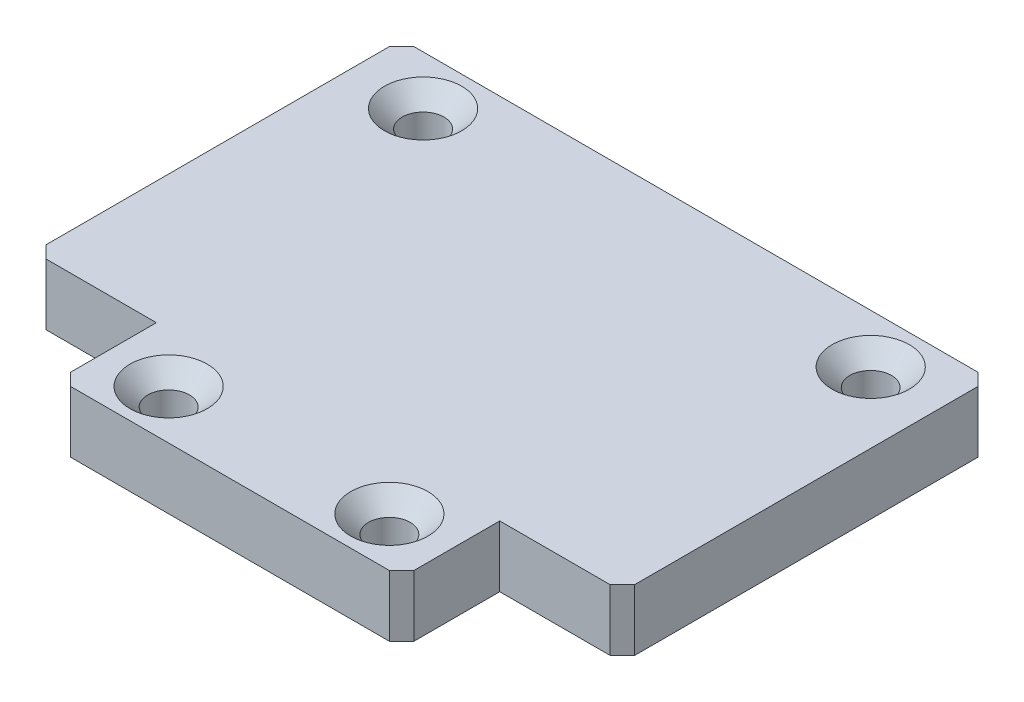
ISO-10303-21;
HEADER;
FILE_DESCRIPTION(('STEP AP214'),'2;1');
FILE_NAME('part.step','',(''),(''),'','','');
FILE_SCHEMA(('AUTOMOTIVE_DESIGN { 1 0 10303 214 1 1 1 1 }'));
ENDSEC;
DATA;
#1=APPLICATION_CONTEXT('core data for automotive mechanical design processes');
#2=APPLICATION_PROTOCOL_DEFINITION('international standard','automotive_design',2000,#1);
#3=PRODUCT_CONTEXT('',#1,'mechanical');
#4=PRODUCT('Part','Part','',(#3));
#5=PRODUCT_RELATED_PRODUCT_CATEGORY('part','',(#4));
#6=PRODUCT_DEFINITION_FORMATION('','',#4);
#7=PRODUCT_DEFINITION_CONTEXT('part definition',#1,'design');
#8=PRODUCT_DEFINITION('design','',#6,#7);
#9=PRODUCT_DEFINITION_SHAPE('','',#8);
#10=(LENGTH_UNIT() NAMED_UNIT(*) SI_UNIT(.MILLI.,.METRE.));
#11=(NAMED_UNIT(*) PLANE_ANGLE_UNIT() SI_UNIT($,.RADIAN.));
#12=(NAMED_UNIT(*) SI_UNIT($,.STERADIAN.) SOLID_ANGLE_UNIT());
#13=UNCERTAINTY_MEASURE_WITH_UNIT(LENGTH_MEASURE(1.E-05),#10,'distance_accuracy_value','');
#14=(GEOMETRIC_REPRESENTATION_CONTEXT(3) GLOBAL_UNCERTAINTY_ASSIGNED_CONTEXT((#13)) GLOBAL_UNIT_ASSIGNED_CONTEXT((#10,
#11,#12)) REPRESENTATION_CONTEXT('',''));
#15=CARTESIAN_POINT('',(0.,0.,0.));
#16=DIRECTION('',(0.,0.,1.));
#17=DIRECTION('',(1.,0.,0.));
#18=AXIS2_PLACEMENT_3D('',#15,#16,#17);
#19=CARTESIAN_POINT('',(10.,5.,0.));
#20=DIRECTION('',(0.,0.,-1.));
#21=DIRECTION('',(-1.,0.,0.));
#22=AXIS2_PLACEMENT_3D('',#19,#20,#21);
#23=PLANE('',#22);
#24=DIRECTION('',(1.,0.,0.));
#25=VECTOR('',#24,1.);
#26=CARTESIAN_POINT('',(10.,5.,0.));
#27=LINE('',#26,#25);
#28=CARTESIAN_POINT('',(1.,5.,0.));
#29=VERTEX_POINT('',#28);
#30=CARTESIAN_POINT('',(10.,5.,0.));
#31=VERTEX_POINT('',#30);
#32=EDGE_CURVE('E145',#29,#31,#27,.T.);
#33=ORIENTED_EDGE('',*,*,#32,.F.);
#34=DIRECTION('',(0.,-1.,0.));
#35=VECTOR('',#34,1.);
#36=CARTESIAN_POINT('',(1.,5.,0.));
#37=LINE('',#36,#35);
#38=CARTESIAN_POINT('',(1.,0.,0.));
#39=VERTEX_POINT('',#38);
#40=EDGE_CURVE('E11',#29,#39,#37,.T.);
#41=ORIENTED_EDGE('',*,*,#40,.T.);
#42=DIRECTION('',(1.,0.,0.));
#43=VECTOR('',#42,1.);
#44=CARTESIAN_POINT('',(10.,0.,0.));
#45=LINE('',#44,#43);
#46=CARTESIAN_POINT('',(10.,0.,0.));
#47=VERTEX_POINT('',#46);
#48=EDGE_CURVE('E170',#39,#47,#45,.T.);
#49=ORIENTED_EDGE('',*,*,#48,.T.);
#50=DIRECTION('',(0.,-1.,0.));
#51=VECTOR('',#50,1.);
#52=CARTESIAN_POINT('',(10.,5.,0.));
#53=LINE('',#52,#51);
#54=EDGE_CURVE('E164',#31,#47,#53,.T.);
#55=ORIENTED_EDGE('',*,*,#54,.F.);
#56=EDGE_LOOP('',(#33,#41,#49,#55));
#57=FACE_BOUND('',#56,.T.);
#58=ADVANCED_FACE('F41',(#57),#23,.F.);
#59=CARTESIAN_POINT('',(10.,5.,7.99999999999999));
#60=DIRECTION('',(1.,0.,0.));
#61=DIRECTION('',(0.,0.,-1.));
#62=AXIS2_PLACEMENT_3D('',#59,#60,#61);
#63=PLANE('',#62);
#64=DIRECTION('',(0.,0.,1.));
#65=VECTOR('',#64,1.);
#66=CARTESIAN_POINT('',(10.,0.,7.99999999999999));
#67=LINE('',#66,#65);
#68=CARTESIAN_POINT('',(10.,0.,6.99999999999999));
#69=VERTEX_POINT('',#68);
#70=EDGE_CURVE('E283',#47,#69,#67,.T.);
#71=ORIENTED_EDGE('',*,*,#70,.T.);
#72=DIRECTION('',(0.,1.,0.));
#73=VECTOR('',#72,1.);
#74=CARTESIAN_POINT('',(10.,5.,6.99999999999999));
#75=LINE('',#74,#73);
#76=CARTESIAN_POINT('',(10.,5.,6.99999999999999));
#77=VERTEX_POINT('',#76);
#78=EDGE_CURVE('E51',#69,#77,#75,.T.);
#79=ORIENTED_EDGE('',*,*,#78,.T.);
#80=DIRECTION('',(0.,0.,1.));
#81=VECTOR('',#80,1.);
#82=CARTESIAN_POINT('',(10.,5.,7.99999999999999));
#83=LINE('',#82,#81);
#84=EDGE_CURVE('E149',#31,#77,#83,.T.);
#85=ORIENTED_EDGE('',*,*,#84,.F.);
#86=ORIENTED_EDGE('',*,*,#54,.T.);
#87=EDGE_LOOP('',(#71,#79,#85,#86));
#88=FACE_BOUND('',#87,.T.);
#89=ADVANCED_FACE('F163',(#88),#63,.F.);
#90=CARTESIAN_POINT('',(38.,5.,7.99999999999999));
#91=DIRECTION('',(0.,0.,-1.));
#92=DIRECTION('',(-1.,0.,0.));
#93=AXIS2_PLACEMENT_3D('',#90,#91,#92);
#94=PLANE('',#93);
#95=DIRECTION('',(1.,0.,0.));
#96=VECTOR('',#95,1.);
#97=CARTESIAN_POINT('',(38.,0.,7.99999999999999));
#98=LINE('',#97,#96);
#99=CARTESIAN_POINT('',(11.,0.,7.99999999999999));
#100=VERTEX_POINT('',#99);
#101=CARTESIAN_POINT('',(37.,0.,7.99999999999999));
#102=VERTEX_POINT('',#101);
#103=EDGE_CURVE('E257',#100,#102,#98,.T.);
#104=ORIENTED_EDGE('',*,*,#103,.T.);
#105=DIRECTION('',(0.,1.,0.));
#106=VECTOR('',#105,1.);
#107=CARTESIAN_POINT('',(37.,5.,7.99999999999999));
#108=LINE('',#107,#106);
#109=CARTESIAN_POINT('',(37.,5.,7.99999999999999));
#110=VERTEX_POINT('',#109);
#111=EDGE_CURVE('E246',#102,#110,#108,.T.);
#112=ORIENTED_EDGE('',*,*,#111,.T.);
#113=DIRECTION('',(1.,0.,0.));
#114=VECTOR('',#113,1.);
#115=CARTESIAN_POINT('',(38.,5.,7.99999999999999));
#116=LINE('',#115,#114);
#117=CARTESIAN_POINT('',(11.,5.,7.99999999999999));
#118=VERTEX_POINT('',#117);
#119=EDGE_CURVE('E167',#118,#110,#116,.T.);
#120=ORIENTED_EDGE('',*,*,#119,.F.);
#121=DIRECTION('',(0.,-1.,0.));
#122=VECTOR('',#121,1.);
#123=CARTESIAN_POINT('',(11.,5.,7.99999999999999));
#124=LINE('',#123,#122);
#125=EDGE_CURVE('E242',#118,#100,#124,.T.);
#126=ORIENTED_EDGE('',*,*,#125,.T.);
#127=EDGE_LOOP('',(#104,#112,#120,#126));
#128=FACE_BOUND('',#127,.T.);
#129=ADVANCED_FACE('F254',(#128),#94,.F.);
#130=CARTESIAN_POINT('',(38.,5.,0.));
#131=DIRECTION('',(-1.,0.,0.));
#132=DIRECTION('',(0.,0.,1.));
#133=AXIS2_PLACEMENT_3D('',#130,#131,#132);
#134=PLANE('',#133);
#135=DIRECTION('',(0.,0.,-1.));
#136=VECTOR('',#135,1.);
#137=CARTESIAN_POINT('',(38.,5.,0.));
#138=LINE('',#137,#136);
#139=CARTESIAN_POINT('',(38.,5.,6.99999999999999));
#140=VERTEX_POINT('',#139);
#141=CARTESIAN_POINT('',(38.,5.,0.));
#142=VERTEX_POINT('',#141);
#143=EDGE_CURVE('E262',#140,#142,#138,.T.);
#144=ORIENTED_EDGE('',*,*,#143,.F.);
#145=DIRECTION('',(0.,-1.,0.));
#146=VECTOR('',#145,1.);
#147=CARTESIAN_POINT('',(38.,5.,6.99999999999999));
#148=LINE('',#147,#146);
#149=CARTESIAN_POINT('',(38.,0.,6.99999999999999));
#150=VERTEX_POINT('',#149);
#151=EDGE_CURVE('E238',#140,#150,#148,.T.);
#152=ORIENTED_EDGE('',*,*,#151,.T.);
#153=DIRECTION('',(0.,0.,-1.));
#154=VECTOR('',#153,1.);
#155=CARTESIAN_POINT('',(38.,0.,0.));
#156=LINE('',#155,#154);
#157=CARTESIAN_POINT('',(38.,0.,0.));
#158=VERTEX_POINT('',#157);
#159=EDGE_CURVE('E270',#150,#158,#156,.T.);
#160=ORIENTED_EDGE('',*,*,#159,.T.);
#161=DIRECTION('',(0.,-1.,0.));
#162=VECTOR('',#161,1.);
#163=CARTESIAN_POINT('',(38.,5.,0.));
#164=LINE('',#163,#162);
#165=EDGE_CURVE('E174',#142,#158,#164,.T.);
#166=ORIENTED_EDGE('',*,*,#165,.F.);
#167=EDGE_LOOP('',(#144,#152,#160,#166));
#168=FACE_BOUND('',#167,.T.);
#169=ADVANCED_FACE('F268',(#168),#134,.F.);
#170=CARTESIAN_POINT('',(48.,5.,0.));
#171=DIRECTION('',(0.,0.,-1.));
#172=DIRECTION('',(-1.,0.,0.));
#173=AXIS2_PLACEMENT_3D('',#170,#171,#172);
#174=PLANE('',#173);
#175=DIRECTION('',(1.,0.,0.));
#176=VECTOR('',#175,1.);
#177=CARTESIAN_POINT('',(48.,0.,0.));
#178=LINE('',#177,#176);
#179=CARTESIAN_POINT('',(47.,0.,0.));
#180=VERTEX_POINT('',#179);
#181=EDGE_CURVE('E276',#158,#180,#178,.T.);
#182=ORIENTED_EDGE('',*,*,#181,.T.);
#183=DIRECTION('',(0.,1.,0.));
#184=VECTOR('',#183,1.);
#185=CARTESIAN_POINT('',(47.,5.,0.));
#186=LINE('',#185,#184);
#187=CARTESIAN_POINT('',(47.,5.,0.));
#188=VERTEX_POINT('',#187);
#189=EDGE_CURVE('E235',#180,#188,#186,.T.);
#190=ORIENTED_EDGE('',*,*,#189,.T.);
#191=DIRECTION('',(1.,0.,0.));
#192=VECTOR('',#191,1.);
#193=CARTESIAN_POINT('',(48.,5.,0.));
#194=LINE('',#193,#192);
#195=EDGE_CURVE('E317',#142,#188,#194,.T.);
#196=ORIENTED_EDGE('',*,*,#195,.F.);
#197=ORIENTED_EDGE('',*,*,#165,.T.);
#198=EDGE_LOOP('',(#182,#190,#196,#197));
#199=FACE_BOUND('',#198,.T.);
#200=ADVANCED_FACE('F511',(#199),#174,.F.);
#201=CARTESIAN_POINT('',(48.,5.,-30.));
#202=DIRECTION('',(-1.,0.,0.));
#203=DIRECTION('',(0.,0.,1.));
#204=AXIS2_PLACEMENT_3D('',#201,#202,#203);
#205=PLANE('',#204);
#206=DIRECTION('',(0.,0.,-1.));
#207=VECTOR('',#206,1.);
#208=CARTESIAN_POINT('',(48.,0.,-30.));
#209=LINE('',#208,#207);
#210=CARTESIAN_POINT('',(48.,0.,-1.));
#211=VERTEX_POINT('',#210);
#212=CARTESIAN_POINT('',(48.,0.,-29.));
#213=VERTEX_POINT('',#212);
#214=EDGE_CURVE('E281',#211,#213,#209,.T.);
#215=ORIENTED_EDGE('',*,*,#214,.T.);
#216=DIRECTION('',(0.,1.,0.));
#217=VECTOR('',#216,1.);
#218=CARTESIAN_POINT('',(48.,5.,-29.));
#219=LINE('',#218,#217);
#220=CARTESIAN_POINT('',(48.,5.,-29.));
#221=VERTEX_POINT('',#220);
#222=EDGE_CURVE('E58',#213,#221,#219,.T.);
#223=ORIENTED_EDGE('',*,*,#222,.T.);
#224=DIRECTION('',(0.,0.,-1.));
#225=VECTOR('',#224,1.);
#226=CARTESIAN_POINT('',(48.,5.,-30.));
#227=LINE('',#226,#225);
#228=CARTESIAN_POINT('',(48.,5.,-1.));
#229=VERTEX_POINT('',#228);
#230=EDGE_CURVE('E314',#229,#221,#227,.T.);
#231=ORIENTED_EDGE('',*,*,#230,.F.);
#232=DIRECTION('',(0.,-1.,0.));
#233=VECTOR('',#232,1.);
#234=CARTESIAN_POINT('',(48.,5.,-1.));
#235=LINE('',#234,#233);
#236=EDGE_CURVE('E229',#229,#211,#235,.T.);
#237=ORIENTED_EDGE('',*,*,#236,.T.);
#238=EDGE_LOOP('',(#215,#223,#231,#237));
#239=FACE_BOUND('',#238,.T.);
#240=ADVANCED_FACE('F501',(#239),#205,.F.);
#241=CARTESIAN_POINT('',(0.,5.,-30.));
#242=DIRECTION('',(0.,0.,1.));
#243=DIRECTION('',(1.,0.,0.));
#244=AXIS2_PLACEMENT_3D('',#241,#242,#243);
#245=PLANE('',#244);
#246=DIRECTION('',(-1.,0.,0.));
#247=VECTOR('',#246,1.);
#248=CARTESIAN_POINT('',(0.,0.,-30.));
#249=LINE('',#248,#247);
#250=CARTESIAN_POINT('',(47.,0.,-30.));
#251=VERTEX_POINT('',#250);
#252=CARTESIAN_POINT('',(1.00000000000001,0.,-30.));
#253=VERTEX_POINT('',#252);
#254=EDGE_CURVE('E289',#251,#253,#249,.T.);
#255=ORIENTED_EDGE('',*,*,#254,.T.);
#256=DIRECTION('',(0.,1.,0.));
#257=VECTOR('',#256,1.);
#258=CARTESIAN_POINT('',(1.00000000000001,5.,-30.));
#259=LINE('',#258,#257);
#260=CARTESIAN_POINT('',(1.00000000000001,5.,-30.));
#261=VERTEX_POINT('',#260);
#262=EDGE_CURVE('E210',#253,#261,#259,.T.);
#263=ORIENTED_EDGE('',*,*,#262,.T.);
#264=DIRECTION('',(-1.,0.,0.));
#265=VECTOR('',#264,1.);
#266=CARTESIAN_POINT('',(0.,5.,-30.));
#267=LINE('',#266,#265);
#268=CARTESIAN_POINT('',(47.,5.,-30.));
#269=VERTEX_POINT('',#268);
#270=EDGE_CURVE('E311',#269,#261,#267,.T.);
#271=ORIENTED_EDGE('',*,*,#270,.F.);
#272=DIRECTION('',(0.,-1.,0.));
#273=VECTOR('',#272,1.);
#274=CARTESIAN_POINT('',(47.,5.,-30.));
#275=LINE('',#274,#273);
#276=EDGE_CURVE('E206',#269,#251,#275,.T.);
#277=ORIENTED_EDGE('',*,*,#276,.T.);
#278=EDGE_LOOP('',(#255,#263,#271,#277));
#279=FACE_BOUND('',#278,.T.);
#280=ADVANCED_FACE('F492',(#279),#245,.F.);
#281=CARTESIAN_POINT('',(0.,5.,0.));
#282=DIRECTION('',(1.,0.,0.));
#283=DIRECTION('',(0.,0.,-1.));
#284=AXIS2_PLACEMENT_3D('',#281,#282,#283);
#285=PLANE('',#284);
#286=DIRECTION('',(0.,0.,1.));
#287=VECTOR('',#286,1.);
#288=CARTESIAN_POINT('',(0.,5.,0.));
#289=LINE('',#288,#287);
#290=CARTESIAN_POINT('',(0.,5.,-29.));
#291=VERTEX_POINT('',#290);
#292=CARTESIAN_POINT('',(0.,5.,-1.00000000000001));
#293=VERTEX_POINT('',#292);
#294=EDGE_CURVE('E181',#291,#293,#289,.T.);
#295=ORIENTED_EDGE('',*,*,#294,.F.);
#296=DIRECTION('',(0.,-1.,0.));
#297=VECTOR('',#296,1.);
#298=CARTESIAN_POINT('',(0.,5.,-29.));
#299=LINE('',#298,#297);
#300=CARTESIAN_POINT('',(0.,0.,-29.));
#301=VERTEX_POINT('',#300);
#302=EDGE_CURVE('E178',#291,#301,#299,.T.);
#303=ORIENTED_EDGE('',*,*,#302,.T.);
#304=DIRECTION('',(0.,0.,1.));
#305=VECTOR('',#304,1.);
#306=CARTESIAN_POINT('',(0.,0.,0.));
#307=LINE('',#306,#305);
#308=CARTESIAN_POINT('',(0.,0.,-1.00000000000001));
#309=VERTEX_POINT('',#308);
#310=EDGE_CURVE('E158',#301,#309,#307,.T.);
#311=ORIENTED_EDGE('',*,*,#310,.T.);
#312=DIRECTION('',(0.,1.,0.));
#313=VECTOR('',#312,1.);
#314=CARTESIAN_POINT('',(0.,5.,-1.00000000000001));
#315=LINE('',#314,#313);
#316=EDGE_CURVE('E173',#309,#293,#315,.T.);
#317=ORIENTED_EDGE('',*,*,#316,.T.);
#318=EDGE_LOOP('',(#295,#303,#311,#317));
#319=FACE_BOUND('',#318,.T.);
#320=ADVANCED_FACE('F297',(#319),#285,.F.);
#321=CARTESIAN_POINT('',(0.,5.,0.));
#322=DIRECTION('',(0.,-1.,0.));
#323=DIRECTION('',(0.,0.,-1.));
#324=AXIS2_PLACEMENT_3D('',#321,#322,#323);
#325=PLANE('',#324);
#326=CARTESIAN_POINT('',(5.75,5.,-26.));
#327=DIRECTION('',(0.,1.,0.));
#328=DIRECTION('',(0.,0.,1.));
#329=AXIS2_PLACEMENT_3D('',#326,#327,#328);
#330=CIRCLE('',#329,3.15);
#331=CARTESIAN_POINT('',(5.75,5.,-22.85));
#332=VERTEX_POINT('',#331);
#333=EDGE_CURVE('E361',#332,#332,#330,.T.);
#334=ORIENTED_EDGE('',*,*,#333,.F.);
#335=EDGE_LOOP('',(#334));
#336=FACE_BOUND('',#335,.T.);
#337=CARTESIAN_POINT('',(42.25,5.,-26.));
#338=DIRECTION('',(0.,1.,0.));
#339=DIRECTION('',(0.,0.,1.));
#340=AXIS2_PLACEMENT_3D('',#337,#338,#339);
#341=CIRCLE('',#340,3.15);
#342=CARTESIAN_POINT('',(42.25,5.,-22.85));
#343=VERTEX_POINT('',#342);
#344=EDGE_CURVE('E349',#343,#343,#341,.T.);
#345=ORIENTED_EDGE('',*,*,#344,.F.);
#346=EDGE_LOOP('',(#345));
#347=FACE_BOUND('',#346,.T.);
#348=CARTESIAN_POINT('',(15.,5.,4.));
#349=DIRECTION('',(0.,1.,0.));
#350=DIRECTION('',(0.,0.,1.));
#351=AXIS2_PLACEMENT_3D('',#348,#349,#350);
#352=CIRCLE('',#351,3.15);
#353=CARTESIAN_POINT('',(15.,5.,7.15));
#354=VERTEX_POINT('',#353);
#355=EDGE_CURVE('E337',#354,#354,#352,.T.);
#356=ORIENTED_EDGE('',*,*,#355,.F.);
#357=EDGE_LOOP('',(#356));
#358=FACE_BOUND('',#357,.T.);
#359=CARTESIAN_POINT('',(33.,5.,4.));
#360=DIRECTION('',(0.,1.,0.));
#361=DIRECTION('',(0.,0.,1.));
#362=AXIS2_PLACEMENT_3D('',#359,#360,#361);
#363=CIRCLE('',#362,3.15);
#364=CARTESIAN_POINT('',(33.,5.,7.15));
#365=VERTEX_POINT('',#364);
#366=EDGE_CURVE('E325',#365,#365,#363,.T.);
#367=ORIENTED_EDGE('',*,*,#366,.F.);
#368=EDGE_LOOP('',(#367));
#369=FACE_BOUND('',#368,.T.);
#370=ORIENTED_EDGE('',*,*,#270,.T.);
#371=DIRECTION('',(0.70710678118655,0.,-0.707106781186545));
#372=VECTOR('',#371,1.);
#373=CARTESIAN_POINT('',(0.,5.,-29.));
#374=LINE('',#373,#372);
#375=EDGE_CURVE('E226',#261,#291,#374,.F.);
#376=ORIENTED_EDGE('',*,*,#375,.T.);
#377=ORIENTED_EDGE('',*,*,#294,.T.);
#378=DIRECTION('',(-0.707106781186545,0.,-0.70710678118655));
#379=VECTOR('',#378,1.);
#380=CARTESIAN_POINT('',(1.,5.,0.));
#381=LINE('',#380,#379);
#382=EDGE_CURVE('E153',#293,#29,#381,.F.);
#383=ORIENTED_EDGE('',*,*,#382,.T.);
#384=ORIENTED_EDGE('',*,*,#32,.T.);
#385=ORIENTED_EDGE('',*,*,#84,.T.);
#386=DIRECTION('',(-0.707106781186545,0.,-0.70710678118655));
#387=VECTOR('',#386,1.);
#388=CARTESIAN_POINT('',(11.,5.,7.99999999999999));
#389=LINE('',#388,#387);
#390=EDGE_CURVE('E215',#77,#118,#389,.F.);
#391=ORIENTED_EDGE('',*,*,#390,.T.);
#392=ORIENTED_EDGE('',*,*,#119,.T.);
#393=DIRECTION('',(-0.70710678118655,0.,0.707106781186545));
#394=VECTOR('',#393,1.);
#395=CARTESIAN_POINT('',(38.,5.,6.99999999999999));
#396=LINE('',#395,#394);
#397=EDGE_CURVE('E218',#110,#140,#396,.F.);
#398=ORIENTED_EDGE('',*,*,#397,.T.);
#399=ORIENTED_EDGE('',*,*,#143,.T.);
#400=ORIENTED_EDGE('',*,*,#195,.T.);
#401=DIRECTION('',(-0.70710678118655,0.,0.707106781186545));
#402=VECTOR('',#401,1.);
#403=CARTESIAN_POINT('',(48.,5.,-1.));
#404=LINE('',#403,#402);
#405=EDGE_CURVE('E65',#188,#229,#404,.F.);
#406=ORIENTED_EDGE('',*,*,#405,.T.);
#407=ORIENTED_EDGE('',*,*,#230,.T.);
#408=DIRECTION('',(0.707106781186543,0.,0.707106781186552));
#409=VECTOR('',#408,1.);
#410=CARTESIAN_POINT('',(47.,5.,-30.));
#411=LINE('',#410,#409);
#412=EDGE_CURVE('E223',#221,#269,#411,.F.);
#413=ORIENTED_EDGE('',*,*,#412,.T.);
#414=EDGE_LOOP('',(#370,#376,#377,#383,#384,#385,#391,#392,#398,#399,#400,#406,#407,#413));
#415=FACE_BOUND('',#414,.T.);
#416=ADVANCED_FACE('F148',(#336,#347,#358,#369,#415),#325,.F.);
#417=CARTESIAN_POINT('',(0.,0.,0.));
#418=DIRECTION('',(0.,-1.,0.));
#419=DIRECTION('',(0.,0.,-1.));
#420=AXIS2_PLACEMENT_3D('',#417,#418,#419);
#421=PLANE('',#420);
#422=CARTESIAN_POINT('',(5.75,0.,-26.));
#423=DIRECTION('',(0.,1.,0.));
#424=DIRECTION('',(0.,0.,1.));
#425=AXIS2_PLACEMENT_3D('',#422,#423,#424);
#426=CIRCLE('',#425,1.7);
#427=CARTESIAN_POINT('',(5.75,0.,-24.3));
#428=VERTEX_POINT('',#427);
#429=EDGE_CURVE('E353',#428,#428,#426,.T.);
#430=ORIENTED_EDGE('',*,*,#429,.T.);
#431=EDGE_LOOP('',(#430));
#432=FACE_BOUND('',#431,.T.);
#433=CARTESIAN_POINT('',(42.25,0.,-26.));
#434=DIRECTION('',(0.,1.,0.));
#435=DIRECTION('',(0.,0.,1.));
#436=AXIS2_PLACEMENT_3D('',#433,#434,#435);
#437=CIRCLE('',#436,1.7);
#438=CARTESIAN_POINT('',(42.25,0.,-24.3));
#439=VERTEX_POINT('',#438);
#440=EDGE_CURVE('E341',#439,#439,#437,.T.);
#441=ORIENTED_EDGE('',*,*,#440,.T.);
#442=EDGE_LOOP('',(#441));
#443=FACE_BOUND('',#442,.T.);
#444=CARTESIAN_POINT('',(15.,0.,4.));
#445=DIRECTION('',(0.,1.,0.));
#446=DIRECTION('',(0.,0.,1.));
#447=AXIS2_PLACEMENT_3D('',#444,#445,#446);
#448=CIRCLE('',#447,1.7);
#449=CARTESIAN_POINT('',(15.,0.,5.7));
#450=VERTEX_POINT('',#449);
#451=EDGE_CURVE('E329',#450,#450,#448,.T.);
#452=ORIENTED_EDGE('',*,*,#451,.T.);
#453=EDGE_LOOP('',(#452));
#454=FACE_BOUND('',#453,.T.);
#455=CARTESIAN_POINT('',(33.,0.,4.));
#456=DIRECTION('',(0.,1.,0.));
#457=DIRECTION('',(0.,0.,1.));
#458=AXIS2_PLACEMENT_3D('',#455,#456,#457);
#459=CIRCLE('',#458,1.7);
#460=CARTESIAN_POINT('',(33.,0.,5.7));
#461=VERTEX_POINT('',#460);
#462=EDGE_CURVE('E301',#461,#461,#459,.T.);
#463=ORIENTED_EDGE('',*,*,#462,.T.);
#464=EDGE_LOOP('',(#463));
#465=FACE_BOUND('',#464,.T.);
#466=ORIENTED_EDGE('',*,*,#310,.F.);
#467=DIRECTION('',(-0.70710678118655,0.,0.707106781186545));
#468=VECTOR('',#467,1.);
#469=CARTESIAN_POINT('',(-14.5,0.,-14.5000000000001));
#470=LINE('',#469,#468);
#471=EDGE_CURVE('E203',#301,#253,#470,.F.);
#472=ORIENTED_EDGE('',*,*,#471,.T.);
#473=ORIENTED_EDGE('',*,*,#254,.F.);
#474=DIRECTION('',(-0.707106781186543,0.,-0.707106781186552));
#475=VECTOR('',#474,1.);
#476=CARTESIAN_POINT('',(38.5000000000003,0.,-38.4999999999998));
#477=LINE('',#476,#475);
#478=EDGE_CURVE('E200',#251,#213,#477,.F.);
#479=ORIENTED_EDGE('',*,*,#478,.T.);
#480=ORIENTED_EDGE('',*,*,#214,.F.);
#481=DIRECTION('',(0.70710678118655,0.,-0.707106781186545));
#482=VECTOR('',#481,1.);
#483=CARTESIAN_POINT('',(23.4999999999998,0.,23.5));
#484=LINE('',#483,#482);
#485=EDGE_CURVE('E197',#211,#180,#484,.F.);
#486=ORIENTED_EDGE('',*,*,#485,.T.);
#487=ORIENTED_EDGE('',*,*,#181,.F.);
#488=ORIENTED_EDGE('',*,*,#159,.F.);
#489=DIRECTION('',(0.70710678118655,0.,-0.707106781186545));
#490=VECTOR('',#489,1.);
#491=CARTESIAN_POINT('',(22.4999999999999,0.,22.5));
#492=LINE('',#491,#490);
#493=EDGE_CURVE('E194',#150,#102,#492,.F.);
#494=ORIENTED_EDGE('',*,*,#493,.T.);
#495=ORIENTED_EDGE('',*,*,#103,.F.);
#496=DIRECTION('',(0.707106781186545,0.,0.70710678118655));
#497=VECTOR('',#496,1.);
#498=CARTESIAN_POINT('',(1.50000000000004,0.,-1.50000000000003));
#499=LINE('',#498,#497);
#500=EDGE_CURVE('E191',#100,#69,#499,.F.);
#501=ORIENTED_EDGE('',*,*,#500,.T.);
#502=ORIENTED_EDGE('',*,*,#70,.F.);
#503=ORIENTED_EDGE('',*,*,#48,.F.);
#504=DIRECTION('',(0.707106781186545,0.,0.70710678118655));
#505=VECTOR('',#504,1.);
#506=CARTESIAN_POINT('',(0.500000000000004,0.,-0.5));
#507=LINE('',#506,#505);
#508=EDGE_CURVE('E188',#39,#309,#507,.F.);
#509=ORIENTED_EDGE('',*,*,#508,.T.);
#510=EDGE_LOOP('',(#466,#472,#473,#479,#480,#486,#487,#488,#494,#495,#501,#502,#503,#509));
#511=FACE_BOUND('',#510,.T.);
#512=ADVANCED_FACE('F274',(#432,#443,#454,#465,#511),#421,.T.);
#513=CARTESIAN_POINT('',(33.,5.,4.));
#514=DIRECTION('',(0.,1.,0.));
#515=DIRECTION('',(0.,0.,1.));
#516=AXIS2_PLACEMENT_3D('',#513,#514,#515);
#517=CYLINDRICAL_SURFACE('',#516,1.7);
#518=ORIENTED_EDGE('',*,*,#462,.F.);
#519=EDGE_LOOP('',(#518));
#520=FACE_BOUND('',#519,.T.);
#521=CARTESIAN_POINT('',(33.,3.55,4.));
#522=DIRECTION('',(0.,1.,0.));
#523=DIRECTION('',(0.,0.,1.));
#524=AXIS2_PLACEMENT_3D('',#521,#522,#523);
#525=CIRCLE('',#524,1.7);
#526=CARTESIAN_POINT('',(33.,3.55,5.7));
#527=VERTEX_POINT('',#526);
#528=EDGE_CURVE('E306',#527,#527,#525,.T.);
#529=ORIENTED_EDGE('',*,*,#528,.T.);
#530=EDGE_LOOP('',(#529));
#531=FACE_BOUND('',#530,.T.);
#532=ADVANCED_FACE('F380',(#520,#531),#517,.F.);
#533=CARTESIAN_POINT('',(33.,5.,4.));
#534=DIRECTION('',(0.,1.,0.));
#535=DIRECTION('',(0.,0.,1.));
#536=AXIS2_PLACEMENT_3D('',#533,#534,#535);
#537=CONICAL_SURFACE('',#536,3.15,0.785398163397447);
#538=ORIENTED_EDGE('',*,*,#528,.F.);
#539=EDGE_LOOP('',(#538));
#540=FACE_BOUND('',#539,.T.);
#541=ORIENTED_EDGE('',*,*,#366,.T.);
#542=EDGE_LOOP('',(#541));
#543=FACE_BOUND('',#542,.T.);
#544=ADVANCED_FACE('F377',(#540,#543),#537,.F.);
#545=CARTESIAN_POINT('',(15.,5.,4.));
#546=DIRECTION('',(0.,1.,0.));
#547=DIRECTION('',(0.,0.,1.));
#548=AXIS2_PLACEMENT_3D('',#545,#546,#547);
#549=CYLINDRICAL_SURFACE('',#548,1.7);
#550=ORIENTED_EDGE('',*,*,#451,.F.);
#551=EDGE_LOOP('',(#550));
#552=FACE_BOUND('',#551,.T.);
#553=CARTESIAN_POINT('',(15.,3.55,4.));
#554=DIRECTION('',(0.,1.,0.));
#555=DIRECTION('',(0.,0.,1.));
#556=AXIS2_PLACEMENT_3D('',#553,#554,#555);
#557=CIRCLE('',#556,1.7);
#558=CARTESIAN_POINT('',(15.,3.55,5.7));
#559=VERTEX_POINT('',#558);
#560=EDGE_CURVE('E333',#559,#559,#557,.T.);
#561=ORIENTED_EDGE('',*,*,#560,.T.);
#562=EDGE_LOOP('',(#561));
#563=FACE_BOUND('',#562,.T.);
#564=ADVANCED_FACE('F379',(#552,#563),#549,.F.);
#565=CARTESIAN_POINT('',(15.,5.,4.));
#566=DIRECTION('',(0.,1.,0.));
#567=DIRECTION('',(0.,0.,1.));
#568=AXIS2_PLACEMENT_3D('',#565,#566,#567);
#569=CONICAL_SURFACE('',#568,3.15,0.785398163397447);
#570=ORIENTED_EDGE('',*,*,#560,.F.);
#571=EDGE_LOOP('',(#570));
#572=FACE_BOUND('',#571,.T.);
#573=ORIENTED_EDGE('',*,*,#355,.T.);
#574=EDGE_LOOP('',(#573));
#575=FACE_BOUND('',#574,.T.);
#576=ADVANCED_FACE('F387',(#572,#575),#569,.F.);
#577=CARTESIAN_POINT('',(42.25,5.,-26.));
#578=DIRECTION('',(0.,1.,0.));
#579=DIRECTION('',(0.,0.,1.));
#580=AXIS2_PLACEMENT_3D('',#577,#578,#579);
#581=CYLINDRICAL_SURFACE('',#580,1.7);
#582=ORIENTED_EDGE('',*,*,#440,.F.);
#583=EDGE_LOOP('',(#582));
#584=FACE_BOUND('',#583,.T.);
#585=CARTESIAN_POINT('',(42.25,3.55,-26.));
#586=DIRECTION('',(0.,1.,0.));
#587=DIRECTION('',(0.,0.,1.));
#588=AXIS2_PLACEMENT_3D('',#585,#586,#587);
#589=CIRCLE('',#588,1.7);
#590=CARTESIAN_POINT('',(42.25,3.55,-24.3));
#591=VERTEX_POINT('',#590);
#592=EDGE_CURVE('E345',#591,#591,#589,.T.);
#593=ORIENTED_EDGE('',*,*,#592,.T.);
#594=EDGE_LOOP('',(#593));
#595=FACE_BOUND('',#594,.T.);
#596=ADVANCED_FACE('F572',(#584,#595),#581,.F.);
#597=CARTESIAN_POINT('',(42.25,5.,-26.));
#598=DIRECTION('',(0.,1.,0.));
#599=DIRECTION('',(0.,0.,1.));
#600=AXIS2_PLACEMENT_3D('',#597,#598,#599);
#601=CONICAL_SURFACE('',#600,3.15,0.785398163397447);
#602=ORIENTED_EDGE('',*,*,#592,.F.);
#603=EDGE_LOOP('',(#602));
#604=FACE_BOUND('',#603,.T.);
#605=ORIENTED_EDGE('',*,*,#344,.T.);
#606=EDGE_LOOP('',(#605));
#607=FACE_BOUND('',#606,.T.);
#608=ADVANCED_FACE('F562',(#604,#607),#601,.F.);
#609=CARTESIAN_POINT('',(5.75,5.,-26.));
#610=DIRECTION('',(0.,1.,0.));
#611=DIRECTION('',(0.,0.,1.));
#612=AXIS2_PLACEMENT_3D('',#609,#610,#611);
#613=CYLINDRICAL_SURFACE('',#612,1.7);
#614=ORIENTED_EDGE('',*,*,#429,.F.);
#615=EDGE_LOOP('',(#614));
#616=FACE_BOUND('',#615,.T.);
#617=CARTESIAN_POINT('',(5.75,3.55,-26.));
#618=DIRECTION('',(0.,1.,0.));
#619=DIRECTION('',(0.,0.,1.));
#620=AXIS2_PLACEMENT_3D('',#617,#618,#619);
#621=CIRCLE('',#620,1.7);
#622=CARTESIAN_POINT('',(5.75,3.55,-24.3));
#623=VERTEX_POINT('',#622);
#624=EDGE_CURVE('E357',#623,#623,#621,.T.);
#625=ORIENTED_EDGE('',*,*,#624,.T.);
#626=EDGE_LOOP('',(#625));
#627=FACE_BOUND('',#626,.T.);
#628=ADVANCED_FACE('F552',(#616,#627),#613,.F.);
#629=CARTESIAN_POINT('',(5.75,5.,-26.));
#630=DIRECTION('',(0.,1.,0.));
#631=DIRECTION('',(0.,0.,1.));
#632=AXIS2_PLACEMENT_3D('',#629,#630,#631);
#633=CONICAL_SURFACE('',#632,3.15,0.785398163397448);
#634=ORIENTED_EDGE('',*,*,#624,.F.);
#635=EDGE_LOOP('',(#634));
#636=FACE_BOUND('',#635,.T.);
#637=ORIENTED_EDGE('',*,*,#333,.T.);
#638=EDGE_LOOP('',(#637));
#639=FACE_BOUND('',#638,.T.);
#640=ADVANCED_FACE('F366',(#636,#639),#633,.F.);
#641=CARTESIAN_POINT('',(0.,5.,-29.));
#642=DIRECTION('',(0.707106781186545,0.,0.70710678118655));
#643=DIRECTION('',(0.,-1.,0.));
#644=AXIS2_PLACEMENT_3D('',#641,#642,#643);
#645=PLANE('',#644);
#646=ORIENTED_EDGE('',*,*,#375,.F.);
#647=ORIENTED_EDGE('',*,*,#262,.F.);
#648=ORIENTED_EDGE('',*,*,#471,.F.);
#649=ORIENTED_EDGE('',*,*,#302,.F.);
#650=EDGE_LOOP('',(#646,#647,#648,#649));
#651=FACE_BOUND('',#650,.T.);
#652=ADVANCED_FACE('F402',(#651),#645,.F.);
#653=CARTESIAN_POINT('',(47.,5.,-30.));
#654=DIRECTION('',(-0.707106781186552,0.,0.707106781186542));
#655=DIRECTION('',(0.,-1.,0.));
#656=AXIS2_PLACEMENT_3D('',#653,#654,#655);
#657=PLANE('',#656);
#658=ORIENTED_EDGE('',*,*,#412,.F.);
#659=ORIENTED_EDGE('',*,*,#222,.F.);
#660=ORIENTED_EDGE('',*,*,#478,.F.);
#661=ORIENTED_EDGE('',*,*,#276,.F.);
#662=EDGE_LOOP('',(#658,#659,#660,#661));
#663=FACE_BOUND('',#662,.T.);
#664=ADVANCED_FACE('F408',(#663),#657,.F.);
#665=CARTESIAN_POINT('',(48.,5.,-1.));
#666=DIRECTION('',(-0.707106781186545,0.,-0.70710678118655));
#667=DIRECTION('',(0.,-1.,0.));
#668=AXIS2_PLACEMENT_3D('',#665,#666,#667);
#669=PLANE('',#668);
#670=ORIENTED_EDGE('',*,*,#405,.F.);
#671=ORIENTED_EDGE('',*,*,#189,.F.);
#672=ORIENTED_EDGE('',*,*,#485,.F.);
#673=ORIENTED_EDGE('',*,*,#236,.F.);
#674=EDGE_LOOP('',(#670,#671,#672,#673));
#675=FACE_BOUND('',#674,.T.);
#676=ADVANCED_FACE('F415',(#675),#669,.F.);
#677=CARTESIAN_POINT('',(38.,5.,6.99999999999999));
#678=DIRECTION('',(-0.707106781186545,0.,-0.70710678118655));
#679=DIRECTION('',(0.,-1.,0.));
#680=AXIS2_PLACEMENT_3D('',#677,#678,#679);
#681=PLANE('',#680);
#682=ORIENTED_EDGE('',*,*,#397,.F.);
#683=ORIENTED_EDGE('',*,*,#111,.F.);
#684=ORIENTED_EDGE('',*,*,#493,.F.);
#685=ORIENTED_EDGE('',*,*,#151,.F.);
#686=EDGE_LOOP('',(#682,#683,#684,#685));
#687=FACE_BOUND('',#686,.T.);
#688=ADVANCED_FACE('F265',(#687),#681,.F.);
#689=CARTESIAN_POINT('',(11.,5.,7.99999999999999));
#690=DIRECTION('',(0.70710678118655,0.,-0.707106781186545));
#691=DIRECTION('',(0.,-1.,0.));
#692=AXIS2_PLACEMENT_3D('',#689,#690,#691);
#693=PLANE('',#692);
#694=ORIENTED_EDGE('',*,*,#390,.F.);
#695=ORIENTED_EDGE('',*,*,#78,.F.);
#696=ORIENTED_EDGE('',*,*,#500,.F.);
#697=ORIENTED_EDGE('',*,*,#125,.F.);
#698=EDGE_LOOP('',(#694,#695,#696,#697));
#699=FACE_BOUND('',#698,.T.);
#700=ADVANCED_FACE('F427',(#699),#693,.F.);
#701=CARTESIAN_POINT('',(1.,5.,0.));
#702=DIRECTION('',(0.70710678118655,0.,-0.707106781186545));
#703=DIRECTION('',(0.,-1.,0.));
#704=AXIS2_PLACEMENT_3D('',#701,#702,#703);
#705=PLANE('',#704);
#706=ORIENTED_EDGE('',*,*,#382,.F.);
#707=ORIENTED_EDGE('',*,*,#316,.F.);
#708=ORIENTED_EDGE('',*,*,#508,.F.);
#709=ORIENTED_EDGE('',*,*,#40,.F.);
#710=EDGE_LOOP('',(#706,#707,#708,#709));
#711=FACE_BOUND('',#710,.T.);
#712=ADVANCED_FACE('F44',(#711),#705,.F.);
#713=CLOSED_SHELL('',(#58,#89,#129,#169,#200,#240,#280,#320,#416,#512,#532,#544,#564,#576,#596,
#608,#628,#640,#652,#664,#676,#688,#700,#712));
#714=MANIFOLD_SOLID_BREP('B2',#713);
#715=ADVANCED_BREP_SHAPE_REPRESENTATION('',(#18,#714),#14);
#716=SHAPE_DEFINITION_REPRESENTATION(#9,#715);
ENDSEC;
END-ISO-10303-21;
